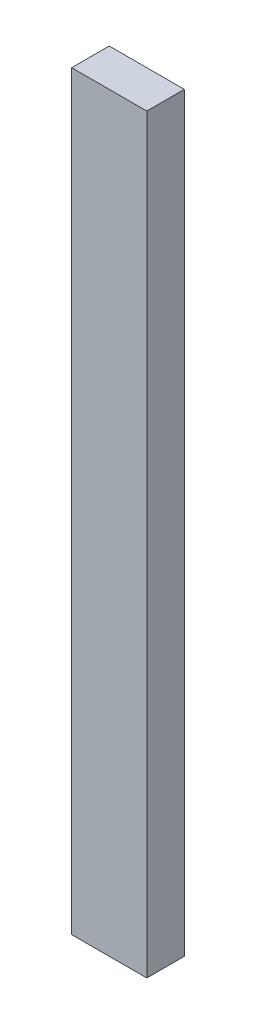
ISO-10303-21;
HEADER;
FILE_DESCRIPTION(('STEP AP214'),'2;1');
FILE_NAME('part.step','',(''),(''),'','','');
FILE_SCHEMA(('AUTOMOTIVE_DESIGN { 1 0 10303 214 1 1 1 1 }'));
ENDSEC;
DATA;
#1=APPLICATION_CONTEXT('core data for automotive mechanical design processes');
#2=APPLICATION_PROTOCOL_DEFINITION('international standard','automotive_design',2000,#1);
#3=PRODUCT_CONTEXT('',#1,'mechanical');
#4=PRODUCT('Part','Part','',(#3));
#5=PRODUCT_RELATED_PRODUCT_CATEGORY('part','',(#4));
#6=PRODUCT_DEFINITION_FORMATION('','',#4);
#7=PRODUCT_DEFINITION_CONTEXT('part definition',#1,'design');
#8=PRODUCT_DEFINITION('design','',#6,#7);
#9=PRODUCT_DEFINITION_SHAPE('','',#8);
#10=(LENGTH_UNIT() NAMED_UNIT(*) SI_UNIT(.MILLI.,.METRE.));
#11=(NAMED_UNIT(*) PLANE_ANGLE_UNIT() SI_UNIT($,.RADIAN.));
#12=(NAMED_UNIT(*) SI_UNIT($,.STERADIAN.) SOLID_ANGLE_UNIT());
#13=UNCERTAINTY_MEASURE_WITH_UNIT(LENGTH_MEASURE(1.E-05),#10,'distance_accuracy_value','');
#14=(GEOMETRIC_REPRESENTATION_CONTEXT(3) GLOBAL_UNCERTAINTY_ASSIGNED_CONTEXT((#13)) GLOBAL_UNIT_ASSIGNED_CONTEXT((#10,
#11,#12)) REPRESENTATION_CONTEXT('',''));
#15=CARTESIAN_POINT('',(0.,0.,0.));
#16=DIRECTION('',(0.,0.,1.));
#17=DIRECTION('',(1.,0.,0.));
#18=AXIS2_PLACEMENT_3D('',#15,#16,#17);
#19=CARTESIAN_POINT('',(0.,1000.,0.));
#20=DIRECTION('',(-1.,0.,0.));
#21=DIRECTION('',(0.,0.,1.));
#22=AXIS2_PLACEMENT_3D('',#19,#20,#21);
#23=PLANE('',#22);
#24=DIRECTION('',(0.,0.,-1.));
#25=VECTOR('',#24,1.);
#26=CARTESIAN_POINT('',(0.,0.,0.));
#27=LINE('',#26,#25);
#28=CARTESIAN_POINT('',(0.,0.,0.));
#29=VERTEX_POINT('',#28);
#30=CARTESIAN_POINT('',(0.,0.,-50.));
#31=VERTEX_POINT('',#30);
#32=EDGE_CURVE('E96',#29,#31,#27,.T.);
#33=ORIENTED_EDGE('',*,*,#32,.T.);
#34=DIRECTION('',(0.,-1.,0.));
#35=VECTOR('',#34,1.);
#36=CARTESIAN_POINT('',(0.,1000.,-50.));
#37=LINE('',#36,#35);
#38=CARTESIAN_POINT('',(0.,1000.,-50.));
#39=VERTEX_POINT('',#38);
#40=EDGE_CURVE('E11',#39,#31,#37,.T.);
#41=ORIENTED_EDGE('',*,*,#40,.F.);
#42=DIRECTION('',(0.,0.,-1.));
#43=VECTOR('',#42,1.);
#44=CARTESIAN_POINT('',(0.,1000.,0.));
#45=LINE('',#44,#43);
#46=CARTESIAN_POINT('',(0.,1000.,0.));
#47=VERTEX_POINT('',#46);
#48=EDGE_CURVE('E84',#47,#39,#45,.T.);
#49=ORIENTED_EDGE('',*,*,#48,.F.);
#50=DIRECTION('',(0.,-1.,0.));
#51=VECTOR('',#50,1.);
#52=CARTESIAN_POINT('',(0.,1000.,0.));
#53=LINE('',#52,#51);
#54=EDGE_CURVE('E92',#47,#29,#53,.T.);
#55=ORIENTED_EDGE('',*,*,#54,.T.);
#56=EDGE_LOOP('',(#33,#41,#49,#55));
#57=FACE_BOUND('',#56,.T.);
#58=ADVANCED_FACE('F33',(#57),#23,.F.);
#59=CARTESIAN_POINT('',(0.,1000.,-50.));
#60=DIRECTION('',(0.,0.,1.));
#61=DIRECTION('',(1.,0.,0.));
#62=AXIS2_PLACEMENT_3D('',#59,#60,#61);
#63=PLANE('',#62);
#64=DIRECTION('',(-1.,0.,0.));
#65=VECTOR('',#64,1.);
#66=CARTESIAN_POINT('',(0.,0.,-50.));
#67=LINE('',#66,#65);
#68=CARTESIAN_POINT('',(-100.,0.,-50.));
#69=VERTEX_POINT('',#68);
#70=EDGE_CURVE('E88',#31,#69,#67,.T.);
#71=ORIENTED_EDGE('',*,*,#70,.T.);
#72=DIRECTION('',(0.,-1.,0.));
#73=VECTOR('',#72,1.);
#74=CARTESIAN_POINT('',(-100.,1000.,-50.));
#75=LINE('',#74,#73);
#76=CARTESIAN_POINT('',(-100.,1000.,-50.));
#77=VERTEX_POINT('',#76);
#78=EDGE_CURVE('E41',#77,#69,#75,.T.);
#79=ORIENTED_EDGE('',*,*,#78,.F.);
#80=DIRECTION('',(-1.,0.,0.));
#81=VECTOR('',#80,1.);
#82=CARTESIAN_POINT('',(0.,1000.,-50.));
#83=LINE('',#82,#81);
#84=EDGE_CURVE('E79',#39,#77,#83,.T.);
#85=ORIENTED_EDGE('',*,*,#84,.F.);
#86=ORIENTED_EDGE('',*,*,#40,.T.);
#87=EDGE_LOOP('',(#71,#79,#85,#86));
#88=FACE_BOUND('',#87,.T.);
#89=ADVANCED_FACE('F87',(#88),#63,.F.);
#90=CARTESIAN_POINT('',(-100.,1000.,0.));
#91=DIRECTION('',(1.,0.,0.));
#92=DIRECTION('',(0.,0.,-1.));
#93=AXIS2_PLACEMENT_3D('',#90,#91,#92);
#94=PLANE('',#93);
#95=DIRECTION('',(0.,0.,1.));
#96=VECTOR('',#95,1.);
#97=CARTESIAN_POINT('',(-100.,0.,0.));
#98=LINE('',#97,#96);
#99=CARTESIAN_POINT('',(-100.,0.,0.));
#100=VERTEX_POINT('',#99);
#101=EDGE_CURVE('E66',#69,#100,#98,.T.);
#102=ORIENTED_EDGE('',*,*,#101,.T.);
#103=DIRECTION('',(0.,-1.,0.));
#104=VECTOR('',#103,1.);
#105=CARTESIAN_POINT('',(-100.,1000.,0.));
#106=LINE('',#105,#104);
#107=CARTESIAN_POINT('',(-100.,1000.,0.));
#108=VERTEX_POINT('',#107);
#109=EDGE_CURVE('E89',#108,#100,#106,.T.);
#110=ORIENTED_EDGE('',*,*,#109,.F.);
#111=DIRECTION('',(0.,0.,1.));
#112=VECTOR('',#111,1.);
#113=CARTESIAN_POINT('',(-100.,1000.,0.));
#114=LINE('',#113,#112);
#115=EDGE_CURVE('E82',#77,#108,#114,.T.);
#116=ORIENTED_EDGE('',*,*,#115,.F.);
#117=ORIENTED_EDGE('',*,*,#78,.T.);
#118=EDGE_LOOP('',(#102,#110,#116,#117));
#119=FACE_BOUND('',#118,.T.);
#120=ADVANCED_FACE('F90',(#119),#94,.F.);
#121=CARTESIAN_POINT('',(0.,1000.,0.));
#122=DIRECTION('',(0.,0.,-1.));
#123=DIRECTION('',(-1.,0.,0.));
#124=AXIS2_PLACEMENT_3D('',#121,#122,#123);
#125=PLANE('',#124);
#126=DIRECTION('',(1.,0.,0.));
#127=VECTOR('',#126,1.);
#128=CARTESIAN_POINT('',(0.,0.,0.));
#129=LINE('',#128,#127);
#130=EDGE_CURVE('E72',#100,#29,#129,.T.);
#131=ORIENTED_EDGE('',*,*,#130,.T.);
#132=ORIENTED_EDGE('',*,*,#54,.F.);
#133=DIRECTION('',(1.,0.,0.));
#134=VECTOR('',#133,1.);
#135=CARTESIAN_POINT('',(0.,1000.,0.));
#136=LINE('',#135,#134);
#137=EDGE_CURVE('E49',#108,#47,#136,.T.);
#138=ORIENTED_EDGE('',*,*,#137,.F.);
#139=ORIENTED_EDGE('',*,*,#109,.T.);
#140=EDGE_LOOP('',(#131,#132,#138,#139));
#141=FACE_BOUND('',#140,.T.);
#142=ADVANCED_FACE('F103',(#141),#125,.F.);
#143=CARTESIAN_POINT('',(0.,1000.,0.));
#144=DIRECTION('',(0.,1.,0.));
#145=DIRECTION('',(0.,0.,1.));
#146=AXIS2_PLACEMENT_3D('',#143,#144,#145);
#147=PLANE('',#146);
#148=ORIENTED_EDGE('',*,*,#48,.T.);
#149=ORIENTED_EDGE('',*,*,#84,.T.);
#150=ORIENTED_EDGE('',*,*,#115,.T.);
#151=ORIENTED_EDGE('',*,*,#137,.T.);
#152=EDGE_LOOP('',(#148,#149,#150,#151));
#153=FACE_BOUND('',#152,.T.);
#154=ADVANCED_FACE('F80',(#153),#147,.T.);
#155=CARTESIAN_POINT('',(0.,0.,0.));
#156=DIRECTION('',(0.,1.,0.));
#157=DIRECTION('',(0.,0.,1.));
#158=AXIS2_PLACEMENT_3D('',#155,#156,#157);
#159=PLANE('',#158);
#160=ORIENTED_EDGE('',*,*,#32,.F.);
#161=ORIENTED_EDGE('',*,*,#130,.F.);
#162=ORIENTED_EDGE('',*,*,#101,.F.);
#163=ORIENTED_EDGE('',*,*,#70,.F.);
#164=EDGE_LOOP('',(#160,#161,#162,#163));
#165=FACE_BOUND('',#164,.T.);
#166=ADVANCED_FACE('F106',(#165),#159,.F.);
#167=CLOSED_SHELL('',(#58,#89,#120,#142,#154,#166));
#168=MANIFOLD_SOLID_BREP('B2',#167);
#169=ADVANCED_BREP_SHAPE_REPRESENTATION('',(#18,#168),#14);
#170=SHAPE_DEFINITION_REPRESENTATION(#9,#169);
ENDSEC;
END-ISO-10303-21;
